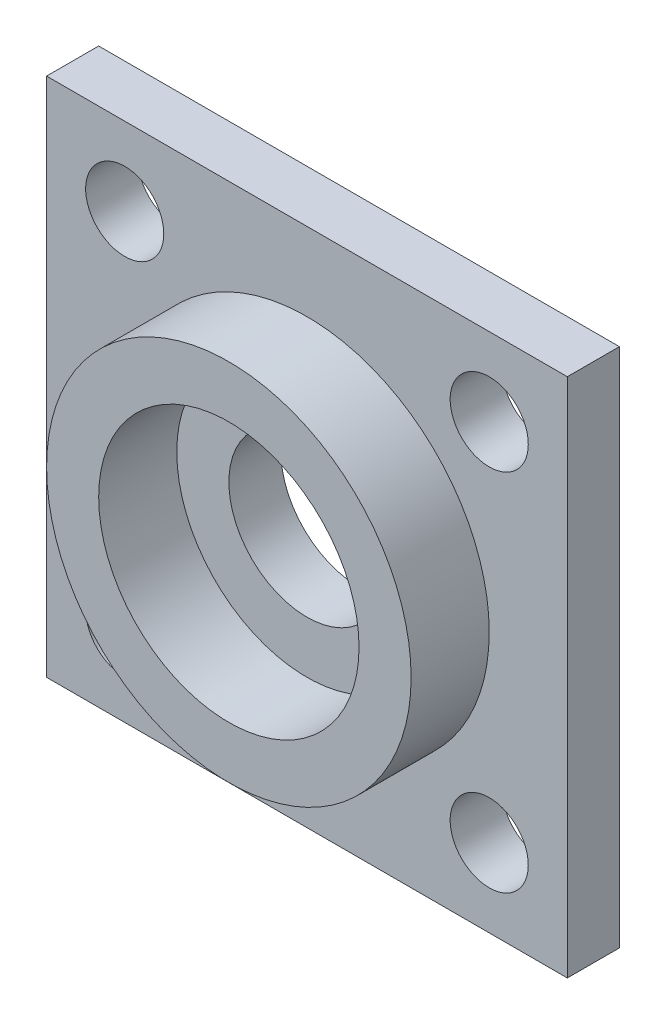
ISO-10303-21;
HEADER;
FILE_DESCRIPTION(('STEP AP214'),'2;1');
FILE_NAME('part.step','',(''),(''),'','','');
FILE_SCHEMA(('AUTOMOTIVE_DESIGN { 1 0 10303 214 1 1 1 1 }'));
ENDSEC;
DATA;
#1=APPLICATION_CONTEXT('core data for automotive mechanical design processes');
#2=APPLICATION_PROTOCOL_DEFINITION('international standard','automotive_design',2000,#1);
#3=PRODUCT_CONTEXT('',#1,'mechanical');
#4=PRODUCT('Part','Part','',(#3));
#5=PRODUCT_RELATED_PRODUCT_CATEGORY('part','',(#4));
#6=PRODUCT_DEFINITION_FORMATION('','',#4);
#7=PRODUCT_DEFINITION_CONTEXT('part definition',#1,'design');
#8=PRODUCT_DEFINITION('design','',#6,#7);
#9=PRODUCT_DEFINITION_SHAPE('','',#8);
#10=(LENGTH_UNIT() NAMED_UNIT(*) SI_UNIT(.MILLI.,.METRE.));
#11=(NAMED_UNIT(*) PLANE_ANGLE_UNIT() SI_UNIT($,.RADIAN.));
#12=(NAMED_UNIT(*) SI_UNIT($,.STERADIAN.) SOLID_ANGLE_UNIT());
#13=UNCERTAINTY_MEASURE_WITH_UNIT(LENGTH_MEASURE(1.E-05),#10,'distance_accuracy_value','');
#14=(GEOMETRIC_REPRESENTATION_CONTEXT(3) GLOBAL_UNCERTAINTY_ASSIGNED_CONTEXT((#13)) GLOBAL_UNIT_ASSIGNED_CONTEXT((#10,
#11,#12)) REPRESENTATION_CONTEXT('',''));
#15=CARTESIAN_POINT('',(0.,0.,0.));
#16=DIRECTION('',(0.,0.,1.));
#17=DIRECTION('',(1.,0.,0.));
#18=AXIS2_PLACEMENT_3D('',#15,#16,#17);
#19=CARTESIAN_POINT('',(0.,0.,2.));
#20=DIRECTION('',(0.,0.,1.));
#21=DIRECTION('',(1.,0.,0.));
#22=AXIS2_PLACEMENT_3D('',#19,#20,#21);
#23=PLANE('',#22);
#24=CARTESIAN_POINT('',(0.,0.,2.));
#25=DIRECTION('',(0.,0.,1.));
#26=DIRECTION('',(1.,0.,0.));
#27=AXIS2_PLACEMENT_3D('',#24,#25,#26);
#28=CIRCLE('',#27,3.);
#29=CARTESIAN_POINT('',(3.,0.,2.));
#30=VERTEX_POINT('',#29);
#31=EDGE_CURVE('E154',#30,#30,#28,.T.);
#32=ORIENTED_EDGE('',*,*,#31,.F.);
#33=EDGE_LOOP('',(#32));
#34=FACE_BOUND('',#33,.T.);
#35=CARTESIAN_POINT('',(0.,0.,2.));
#36=DIRECTION('',(0.,0.,1.));
#37=DIRECTION('',(1.,0.,0.));
#38=AXIS2_PLACEMENT_3D('',#35,#36,#37);
#39=CIRCLE('',#38,5.);
#40=CARTESIAN_POINT('',(5.,0.,2.));
#41=VERTEX_POINT('',#40);
#42=EDGE_CURVE('E11',#41,#41,#39,.F.);
#43=ORIENTED_EDGE('',*,*,#42,.F.);
#44=EDGE_LOOP('',(#43));
#45=FACE_BOUND('',#44,.T.);
#46=ADVANCED_FACE('F33',(#34,#45),#23,.T.);
#47=CARTESIAN_POINT('',(0.,0.,2.));
#48=DIRECTION('',(0.,0.,1.));
#49=DIRECTION('',(1.,0.,0.));
#50=AXIS2_PLACEMENT_3D('',#47,#48,#49);
#51=CIRCLE('',#50,7.);
#52=CARTESIAN_POINT('',(7.,0.,2.));
#53=VERTEX_POINT('',#52);
#54=EDGE_CURVE('E142',#53,#53,#51,.T.);
#55=ORIENTED_EDGE('',*,*,#54,.F.);
#56=EDGE_LOOP('',(#55));
#57=FACE_BOUND('',#56,.T.);
#58=CARTESIAN_POINT('',(7.00000000000039,-6.99999999999961,2.));
#59=DIRECTION('',(0.,0.,1.));
#60=DIRECTION('',(1.,0.,0.));
#61=AXIS2_PLACEMENT_3D('',#58,#59,#60);
#62=CIRCLE('',#61,1.50000000000055);
#63=CARTESIAN_POINT('',(8.50000000000094,-6.99999999999961,2.));
#64=VERTEX_POINT('',#63);
#65=EDGE_CURVE('E146',#64,#64,#62,.T.);
#66=ORIENTED_EDGE('',*,*,#65,.F.);
#67=EDGE_LOOP('',(#66));
#68=FACE_BOUND('',#67,.T.);
#69=DIRECTION('',(0.,1.,0.));
#70=VECTOR('',#69,1.);
#71=CARTESIAN_POINT('',(10.,10.,2.));
#72=LINE('',#71,#70);
#73=CARTESIAN_POINT('',(10.,-10.,2.));
#74=VERTEX_POINT('',#73);
#75=CARTESIAN_POINT('',(10.,10.,2.));
#76=VERTEX_POINT('',#75);
#77=EDGE_CURVE('E87',#74,#76,#72,.T.);
#78=ORIENTED_EDGE('',*,*,#77,.T.);
#79=DIRECTION('',(-1.,0.,0.));
#80=VECTOR('',#79,1.);
#81=CARTESIAN_POINT('',(-10.,10.,2.));
#82=LINE('',#81,#80);
#83=CARTESIAN_POINT('',(-10.,10.,2.));
#84=VERTEX_POINT('',#83);
#85=EDGE_CURVE('E81',#76,#84,#82,.T.);
#86=ORIENTED_EDGE('',*,*,#85,.T.);
#87=DIRECTION('',(0.,-1.,0.));
#88=VECTOR('',#87,1.);
#89=CARTESIAN_POINT('',(-10.,10.,2.));
#90=LINE('',#89,#88);
#91=CARTESIAN_POINT('',(-10.,-10.,2.));
#92=VERTEX_POINT('',#91);
#93=EDGE_CURVE('E85',#84,#92,#90,.T.);
#94=ORIENTED_EDGE('',*,*,#93,.T.);
#95=DIRECTION('',(1.,0.,0.));
#96=VECTOR('',#95,1.);
#97=CARTESIAN_POINT('',(-10.,-10.,2.));
#98=LINE('',#97,#96);
#99=EDGE_CURVE('E50',#92,#74,#98,.T.);
#100=ORIENTED_EDGE('',*,*,#99,.T.);
#101=EDGE_LOOP('',(#78,#86,#94,#100));
#102=FACE_BOUND('',#101,.T.);
#103=CARTESIAN_POINT('',(-7.,7.,2.));
#104=DIRECTION('',(0.,0.,1.));
#105=DIRECTION('',(1.,0.,0.));
#106=AXIS2_PLACEMENT_3D('',#103,#104,#105);
#107=CIRCLE('',#106,1.5);
#108=CARTESIAN_POINT('',(-5.5,7.,2.));
#109=VERTEX_POINT('',#108);
#110=EDGE_CURVE('E104',#109,#109,#107,.T.);
#111=ORIENTED_EDGE('',*,*,#110,.F.);
#112=EDGE_LOOP('',(#111));
#113=FACE_BOUND('',#112,.T.);
#114=CARTESIAN_POINT('',(7.,7.00000000000039,2.));
#115=DIRECTION('',(0.,0.,1.));
#116=DIRECTION('',(1.,0.,0.));
#117=AXIS2_PLACEMENT_3D('',#114,#115,#116);
#118=CIRCLE('',#117,1.5000000000004);
#119=CARTESIAN_POINT('',(8.5000000000004,7.00000000000039,2.));
#120=VERTEX_POINT('',#119);
#121=EDGE_CURVE('E150',#120,#120,#118,.T.);
#122=ORIENTED_EDGE('',*,*,#121,.F.);
#123=EDGE_LOOP('',(#122));
#124=FACE_BOUND('',#123,.T.);
#125=CARTESIAN_POINT('',(-6.99999999999961,-7.,2.));
#126=DIRECTION('',(0.,0.,1.));
#127=DIRECTION('',(1.,0.,0.));
#128=AXIS2_PLACEMENT_3D('',#125,#126,#127);
#129=CIRCLE('',#128,1.50000000000021);
#130=CARTESIAN_POINT('',(-5.4999999999994,-7.,2.));
#131=VERTEX_POINT('',#130);
#132=EDGE_CURVE('E136',#131,#131,#129,.T.);
#133=ORIENTED_EDGE('',*,*,#132,.F.);
#134=EDGE_LOOP('',(#133));
#135=FACE_BOUND('',#134,.T.);
#136=ADVANCED_FACE('F82',(#57,#68,#102,#113,#124,#135),#23,.T.);
#137=CARTESIAN_POINT('',(0.,0.,0.));
#138=DIRECTION('',(0.,0.,1.));
#139=DIRECTION('',(1.,0.,0.));
#140=AXIS2_PLACEMENT_3D('',#137,#138,#139);
#141=PLANE('',#140);
#142=DIRECTION('',(0.,1.,0.));
#143=VECTOR('',#142,1.);
#144=CARTESIAN_POINT('',(10.,10.,0.));
#145=LINE('',#144,#143);
#146=CARTESIAN_POINT('',(10.,-10.,0.));
#147=VERTEX_POINT('',#146);
#148=CARTESIAN_POINT('',(10.,10.,0.));
#149=VERTEX_POINT('',#148);
#150=EDGE_CURVE('E101',#147,#149,#145,.T.);
#151=ORIENTED_EDGE('',*,*,#150,.F.);
#152=DIRECTION('',(1.,0.,0.));
#153=VECTOR('',#152,1.);
#154=CARTESIAN_POINT('',(-10.,-10.,0.));
#155=LINE('',#154,#153);
#156=CARTESIAN_POINT('',(-10.,-10.,0.));
#157=VERTEX_POINT('',#156);
#158=EDGE_CURVE('E73',#157,#147,#155,.T.);
#159=ORIENTED_EDGE('',*,*,#158,.F.);
#160=DIRECTION('',(0.,-1.,0.));
#161=VECTOR('',#160,1.);
#162=CARTESIAN_POINT('',(-10.,10.,0.));
#163=LINE('',#162,#161);
#164=CARTESIAN_POINT('',(-10.,10.,0.));
#165=VERTEX_POINT('',#164);
#166=EDGE_CURVE('E67',#165,#157,#163,.T.);
#167=ORIENTED_EDGE('',*,*,#166,.F.);
#168=DIRECTION('',(-1.,0.,0.));
#169=VECTOR('',#168,1.);
#170=CARTESIAN_POINT('',(-10.,10.,0.));
#171=LINE('',#170,#169);
#172=EDGE_CURVE('E92',#149,#165,#171,.T.);
#173=ORIENTED_EDGE('',*,*,#172,.F.);
#174=EDGE_LOOP('',(#151,#159,#167,#173));
#175=FACE_BOUND('',#174,.T.);
#176=CARTESIAN_POINT('',(-7.,7.,0.));
#177=DIRECTION('',(0.,0.,1.));
#178=DIRECTION('',(1.,0.,0.));
#179=AXIS2_PLACEMENT_3D('',#176,#177,#178);
#180=CIRCLE('',#179,1.5);
#181=CARTESIAN_POINT('',(-5.5,7.,0.));
#182=VERTEX_POINT('',#181);
#183=EDGE_CURVE('E119',#182,#182,#180,.T.);
#184=ORIENTED_EDGE('',*,*,#183,.T.);
#185=EDGE_LOOP('',(#184));
#186=FACE_BOUND('',#185,.T.);
#187=CARTESIAN_POINT('',(0.,0.,0.));
#188=DIRECTION('',(0.,0.,1.));
#189=DIRECTION('',(1.,0.,0.));
#190=AXIS2_PLACEMENT_3D('',#187,#188,#189);
#191=CIRCLE('',#190,3.);
#192=CARTESIAN_POINT('',(3.,0.,0.));
#193=VERTEX_POINT('',#192);
#194=EDGE_CURVE('E123',#193,#193,#191,.T.);
#195=ORIENTED_EDGE('',*,*,#194,.T.);
#196=EDGE_LOOP('',(#195));
#197=FACE_BOUND('',#196,.T.);
#198=CARTESIAN_POINT('',(7.,7.00000000000039,0.));
#199=DIRECTION('',(0.,0.,1.));
#200=DIRECTION('',(1.,0.,0.));
#201=AXIS2_PLACEMENT_3D('',#198,#199,#200);
#202=CIRCLE('',#201,1.5000000000004);
#203=CARTESIAN_POINT('',(8.5000000000004,7.00000000000039,0.));
#204=VERTEX_POINT('',#203);
#205=EDGE_CURVE('E127',#204,#204,#202,.T.);
#206=ORIENTED_EDGE('',*,*,#205,.T.);
#207=EDGE_LOOP('',(#206));
#208=FACE_BOUND('',#207,.T.);
#209=CARTESIAN_POINT('',(7.00000000000039,-6.99999999999961,0.));
#210=DIRECTION('',(0.,0.,1.));
#211=DIRECTION('',(1.,0.,0.));
#212=AXIS2_PLACEMENT_3D('',#209,#210,#211);
#213=CIRCLE('',#212,1.50000000000055);
#214=CARTESIAN_POINT('',(8.50000000000094,-6.99999999999961,0.));
#215=VERTEX_POINT('',#214);
#216=EDGE_CURVE('E131',#215,#215,#213,.T.);
#217=ORIENTED_EDGE('',*,*,#216,.T.);
#218=EDGE_LOOP('',(#217));
#219=FACE_BOUND('',#218,.T.);
#220=CARTESIAN_POINT('',(-6.99999999999961,-7.,0.));
#221=DIRECTION('',(0.,0.,1.));
#222=DIRECTION('',(1.,0.,0.));
#223=AXIS2_PLACEMENT_3D('',#220,#221,#222);
#224=CIRCLE('',#223,1.50000000000021);
#225=CARTESIAN_POINT('',(-5.4999999999994,-7.,0.));
#226=VERTEX_POINT('',#225);
#227=EDGE_CURVE('E134',#226,#226,#224,.T.);
#228=ORIENTED_EDGE('',*,*,#227,.T.);
#229=EDGE_LOOP('',(#228));
#230=FACE_BOUND('',#229,.T.);
#231=ADVANCED_FACE('F112',(#175,#186,#197,#208,#219,#230),#141,.F.);
#232=CARTESIAN_POINT('',(10.,10.,2.));
#233=DIRECTION('',(-1.,0.,0.));
#234=DIRECTION('',(0.,-1.,0.));
#235=AXIS2_PLACEMENT_3D('',#232,#233,#234);
#236=PLANE('',#235);
#237=ORIENTED_EDGE('',*,*,#150,.T.);
#238=DIRECTION('',(0.,0.,-1.));
#239=VECTOR('',#238,1.);
#240=CARTESIAN_POINT('',(10.,10.,2.));
#241=LINE('',#240,#239);
#242=EDGE_CURVE('E42',#76,#149,#241,.T.);
#243=ORIENTED_EDGE('',*,*,#242,.F.);
#244=ORIENTED_EDGE('',*,*,#77,.F.);
#245=DIRECTION('',(0.,0.,-1.));
#246=VECTOR('',#245,1.);
#247=CARTESIAN_POINT('',(10.,-10.,2.));
#248=LINE('',#247,#246);
#249=EDGE_CURVE('E97',#74,#147,#248,.T.);
#250=ORIENTED_EDGE('',*,*,#249,.T.);
#251=EDGE_LOOP('',(#237,#243,#244,#250));
#252=FACE_BOUND('',#251,.T.);
#253=ADVANCED_FACE('F35',(#252),#236,.F.);
#254=CARTESIAN_POINT('',(-10.,10.,2.));
#255=DIRECTION('',(0.,-1.,0.));
#256=DIRECTION('',(0.,0.,-1.));
#257=AXIS2_PLACEMENT_3D('',#254,#255,#256);
#258=PLANE('',#257);
#259=ORIENTED_EDGE('',*,*,#172,.T.);
#260=DIRECTION('',(0.,0.,-1.));
#261=VECTOR('',#260,1.);
#262=CARTESIAN_POINT('',(-10.,10.,2.));
#263=LINE('',#262,#261);
#264=EDGE_CURVE('E90',#84,#165,#263,.T.);
#265=ORIENTED_EDGE('',*,*,#264,.F.);
#266=ORIENTED_EDGE('',*,*,#85,.F.);
#267=ORIENTED_EDGE('',*,*,#242,.T.);
#268=EDGE_LOOP('',(#259,#265,#266,#267));
#269=FACE_BOUND('',#268,.T.);
#270=ADVANCED_FACE('F91',(#269),#258,.F.);
#271=CARTESIAN_POINT('',(-10.,10.,2.));
#272=DIRECTION('',(1.,0.,0.));
#273=DIRECTION('',(0.,1.,0.));
#274=AXIS2_PLACEMENT_3D('',#271,#272,#273);
#275=PLANE('',#274);
#276=ORIENTED_EDGE('',*,*,#166,.T.);
#277=DIRECTION('',(0.,0.,-1.));
#278=VECTOR('',#277,1.);
#279=CARTESIAN_POINT('',(-10.,-10.,2.));
#280=LINE('',#279,#278);
#281=EDGE_CURVE('E93',#92,#157,#280,.T.);
#282=ORIENTED_EDGE('',*,*,#281,.F.);
#283=ORIENTED_EDGE('',*,*,#93,.F.);
#284=ORIENTED_EDGE('',*,*,#264,.T.);
#285=EDGE_LOOP('',(#276,#282,#283,#284));
#286=FACE_BOUND('',#285,.T.);
#287=ADVANCED_FACE('F95',(#286),#275,.F.);
#288=CARTESIAN_POINT('',(-10.,-10.,2.));
#289=DIRECTION('',(0.,1.,0.));
#290=DIRECTION('',(0.,0.,1.));
#291=AXIS2_PLACEMENT_3D('',#288,#289,#290);
#292=PLANE('',#291);
#293=ORIENTED_EDGE('',*,*,#158,.T.);
#294=ORIENTED_EDGE('',*,*,#249,.F.);
#295=ORIENTED_EDGE('',*,*,#99,.F.);
#296=ORIENTED_EDGE('',*,*,#281,.T.);
#297=EDGE_LOOP('',(#293,#294,#295,#296));
#298=FACE_BOUND('',#297,.T.);
#299=ADVANCED_FACE('F197',(#298),#292,.F.);
#300=CARTESIAN_POINT('',(-7.,7.,2.));
#301=DIRECTION('',(0.,0.,-1.));
#302=DIRECTION('',(-1.,0.,0.));
#303=AXIS2_PLACEMENT_3D('',#300,#301,#302);
#304=CYLINDRICAL_SURFACE('',#303,1.5);
#305=ORIENTED_EDGE('',*,*,#110,.T.);
#306=EDGE_LOOP('',(#305));
#307=FACE_BOUND('',#306,.T.);
#308=ORIENTED_EDGE('',*,*,#183,.F.);
#309=EDGE_LOOP('',(#308));
#310=FACE_BOUND('',#309,.T.);
#311=ADVANCED_FACE('F162',(#307,#310),#304,.F.);
#312=CARTESIAN_POINT('',(0.,0.,2.));
#313=DIRECTION('',(0.,0.,-1.));
#314=DIRECTION('',(-1.,0.,0.));
#315=AXIS2_PLACEMENT_3D('',#312,#313,#314);
#316=CYLINDRICAL_SURFACE('',#315,3.);
#317=ORIENTED_EDGE('',*,*,#31,.T.);
#318=EDGE_LOOP('',(#317));
#319=FACE_BOUND('',#318,.T.);
#320=ORIENTED_EDGE('',*,*,#194,.F.);
#321=EDGE_LOOP('',(#320));
#322=FACE_BOUND('',#321,.T.);
#323=ADVANCED_FACE('F276',(#319,#322),#316,.F.);
#324=CARTESIAN_POINT('',(7.,7.00000000000039,2.));
#325=DIRECTION('',(0.,0.,-1.));
#326=DIRECTION('',(-1.,0.,0.));
#327=AXIS2_PLACEMENT_3D('',#324,#325,#326);
#328=CYLINDRICAL_SURFACE('',#327,1.5000000000004);
#329=ORIENTED_EDGE('',*,*,#121,.T.);
#330=EDGE_LOOP('',(#329));
#331=FACE_BOUND('',#330,.T.);
#332=ORIENTED_EDGE('',*,*,#205,.F.);
#333=EDGE_LOOP('',(#332));
#334=FACE_BOUND('',#333,.T.);
#335=ADVANCED_FACE('F184',(#331,#334),#328,.F.);
#336=CARTESIAN_POINT('',(7.00000000000039,-6.99999999999961,2.));
#337=DIRECTION('',(0.,0.,-1.));
#338=DIRECTION('',(-1.,0.,0.));
#339=AXIS2_PLACEMENT_3D('',#336,#337,#338);
#340=CYLINDRICAL_SURFACE('',#339,1.50000000000055);
#341=ORIENTED_EDGE('',*,*,#65,.T.);
#342=EDGE_LOOP('',(#341));
#343=FACE_BOUND('',#342,.T.);
#344=ORIENTED_EDGE('',*,*,#216,.F.);
#345=EDGE_LOOP('',(#344));
#346=FACE_BOUND('',#345,.T.);
#347=ADVANCED_FACE('F175',(#343,#346),#340,.F.);
#348=CARTESIAN_POINT('',(-6.99999999999961,-7.,2.));
#349=DIRECTION('',(0.,0.,-1.));
#350=DIRECTION('',(-1.,0.,0.));
#351=AXIS2_PLACEMENT_3D('',#348,#349,#350);
#352=CYLINDRICAL_SURFACE('',#351,1.50000000000021);
#353=ORIENTED_EDGE('',*,*,#132,.T.);
#354=EDGE_LOOP('',(#353));
#355=FACE_BOUND('',#354,.T.);
#356=ORIENTED_EDGE('',*,*,#227,.F.);
#357=EDGE_LOOP('',(#356));
#358=FACE_BOUND('',#357,.T.);
#359=ADVANCED_FACE('F172',(#355,#358),#352,.F.);
#360=CARTESIAN_POINT('',(0.,0.,5.));
#361=DIRECTION('',(0.,0.,1.));
#362=DIRECTION('',(1.,0.,0.));
#363=AXIS2_PLACEMENT_3D('',#360,#361,#362);
#364=PLANE('',#363);
#365=CARTESIAN_POINT('',(0.,0.,5.));
#366=DIRECTION('',(0.,0.,1.));
#367=DIRECTION('',(1.,0.,0.));
#368=AXIS2_PLACEMENT_3D('',#365,#366,#367);
#369=CIRCLE('',#368,7.);
#370=CARTESIAN_POINT('',(7.,0.,5.));
#371=VERTEX_POINT('',#370);
#372=EDGE_CURVE('E137',#371,#371,#369,.T.);
#373=ORIENTED_EDGE('',*,*,#372,.T.);
#374=EDGE_LOOP('',(#373));
#375=FACE_BOUND('',#374,.T.);
#376=CARTESIAN_POINT('',(0.,0.,5.));
#377=DIRECTION('',(0.,0.,1.));
#378=DIRECTION('',(1.,0.,0.));
#379=AXIS2_PLACEMENT_3D('',#376,#377,#378);
#380=CIRCLE('',#379,5.);
#381=CARTESIAN_POINT('',(5.,0.,5.));
#382=VERTEX_POINT('',#381);
#383=EDGE_CURVE('E248',#382,#382,#380,.T.);
#384=ORIENTED_EDGE('',*,*,#383,.F.);
#385=EDGE_LOOP('',(#384));
#386=FACE_BOUND('',#385,.T.);
#387=ADVANCED_FACE('F174',(#375,#386),#364,.T.);
#388=CARTESIAN_POINT('',(0.,0.,5.));
#389=DIRECTION('',(0.,0.,-1.));
#390=DIRECTION('',(-1.,0.,0.));
#391=AXIS2_PLACEMENT_3D('',#388,#389,#390);
#392=CYLINDRICAL_SURFACE('',#391,7.);
#393=ORIENTED_EDGE('',*,*,#372,.F.);
#394=EDGE_LOOP('',(#393));
#395=FACE_BOUND('',#394,.T.);
#396=ORIENTED_EDGE('',*,*,#54,.T.);
#397=EDGE_LOOP('',(#396));
#398=FACE_BOUND('',#397,.T.);
#399=ADVANCED_FACE('F181',(#395,#398),#392,.T.);
#400=CARTESIAN_POINT('',(0.,0.,5.));
#401=DIRECTION('',(0.,0.,-1.));
#402=DIRECTION('',(-1.,0.,0.));
#403=AXIS2_PLACEMENT_3D('',#400,#401,#402);
#404=CYLINDRICAL_SURFACE('',#403,5.);
#405=ORIENTED_EDGE('',*,*,#383,.T.);
#406=EDGE_LOOP('',(#405));
#407=FACE_BOUND('',#406,.T.);
#408=ORIENTED_EDGE('',*,*,#42,.T.);
#409=EDGE_LOOP('',(#408));
#410=FACE_BOUND('',#409,.T.);
#411=ADVANCED_FACE('F232',(#407,#410),#404,.F.);
#412=CLOSED_SHELL('',(#46,#136,#231,#253,#270,#287,#299,#311,#323,#335,#347,#359,#387,#399,#411));
#413=MANIFOLD_SOLID_BREP('B2',#412);
#414=ADVANCED_BREP_SHAPE_REPRESENTATION('',(#18,#413),#14);
#415=SHAPE_DEFINITION_REPRESENTATION(#9,#414);
ENDSEC;
END-ISO-10303-21;
